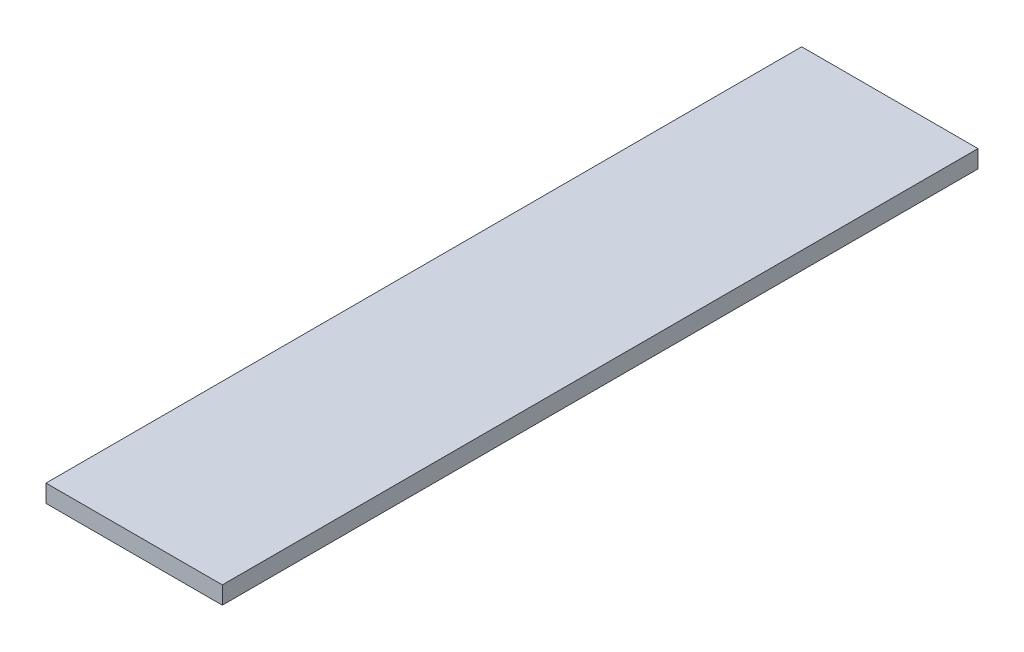
ISO-10303-21;
HEADER;
FILE_DESCRIPTION(('STEP AP214'),'2;1');
FILE_NAME('part.step','',(''),(''),'','','');
FILE_SCHEMA(('AUTOMOTIVE_DESIGN { 1 0 10303 214 1 1 1 1 }'));
ENDSEC;
DATA;
#1=APPLICATION_CONTEXT('core data for automotive mechanical design processes');
#2=APPLICATION_PROTOCOL_DEFINITION('international standard','automotive_design',2000,#1);
#3=PRODUCT_CONTEXT('',#1,'mechanical');
#4=PRODUCT('Part','Part','',(#3));
#5=PRODUCT_RELATED_PRODUCT_CATEGORY('part','',(#4));
#6=PRODUCT_DEFINITION_FORMATION('','',#4);
#7=PRODUCT_DEFINITION_CONTEXT('part definition',#1,'design');
#8=PRODUCT_DEFINITION('design','',#6,#7);
#9=PRODUCT_DEFINITION_SHAPE('','',#8);
#10=(LENGTH_UNIT() NAMED_UNIT(*) SI_UNIT(.MILLI.,.METRE.));
#11=(NAMED_UNIT(*) PLANE_ANGLE_UNIT() SI_UNIT($,.RADIAN.));
#12=(NAMED_UNIT(*) SI_UNIT($,.STERADIAN.) SOLID_ANGLE_UNIT());
#13=UNCERTAINTY_MEASURE_WITH_UNIT(LENGTH_MEASURE(1.E-05),#10,'distance_accuracy_value','');
#14=(GEOMETRIC_REPRESENTATION_CONTEXT(3) GLOBAL_UNCERTAINTY_ASSIGNED_CONTEXT((#13)) GLOBAL_UNIT_ASSIGNED_CONTEXT((#10,
#11,#12)) REPRESENTATION_CONTEXT('',''));
#15=CARTESIAN_POINT('',(0.,0.,0.));
#16=DIRECTION('',(0.,0.,1.));
#17=DIRECTION('',(1.,0.,0.));
#18=AXIS2_PLACEMENT_3D('',#15,#16,#17);
#19=CARTESIAN_POINT('',(0.,0.,-300.));
#20=DIRECTION('',(-1.,0.,0.));
#21=DIRECTION('',(0.,0.,1.));
#22=AXIS2_PLACEMENT_3D('',#19,#20,#21);
#23=PLANE('',#22);
#24=DIRECTION('',(0.,-1.,0.));
#25=VECTOR('',#24,1.);
#26=CARTESIAN_POINT('',(0.,0.,0.));
#27=LINE('',#26,#25);
#28=CARTESIAN_POINT('',(0.,7.,0.));
#29=VERTEX_POINT('',#28);
#30=CARTESIAN_POINT('',(0.,0.,0.));
#31=VERTEX_POINT('',#30);
#32=EDGE_CURVE('E109',#29,#31,#27,.T.);
#33=ORIENTED_EDGE('',*,*,#32,.F.);
#34=DIRECTION('',(0.,0.,1.));
#35=VECTOR('',#34,1.);
#36=CARTESIAN_POINT('',(0.,7.,-300.));
#37=LINE('',#36,#35);
#38=CARTESIAN_POINT('',(0.,7.,-300.));
#39=VERTEX_POINT('',#38);
#40=EDGE_CURVE('E11',#39,#29,#37,.T.);
#41=ORIENTED_EDGE('',*,*,#40,.F.);
#42=DIRECTION('',(0.,-1.,0.));
#43=VECTOR('',#42,1.);
#44=CARTESIAN_POINT('',(0.,0.,-300.));
#45=LINE('',#44,#43);
#46=CARTESIAN_POINT('',(0.,0.,-300.));
#47=VERTEX_POINT('',#46);
#48=EDGE_CURVE('E101',#39,#47,#45,.T.);
#49=ORIENTED_EDGE('',*,*,#48,.T.);
#50=DIRECTION('',(0.,0.,1.));
#51=VECTOR('',#50,1.);
#52=CARTESIAN_POINT('',(0.,0.,-300.));
#53=LINE('',#52,#51);
#54=EDGE_CURVE('E42',#47,#31,#53,.T.);
#55=ORIENTED_EDGE('',*,*,#54,.T.);
#56=EDGE_LOOP('',(#33,#41,#49,#55));
#57=FACE_BOUND('',#56,.T.);
#58=ADVANCED_FACE('F39',(#57),#23,.T.);
#59=CARTESIAN_POINT('',(0.,7.,-300.));
#60=DIRECTION('',(0.,1.,0.));
#61=DIRECTION('',(0.,0.,1.));
#62=AXIS2_PLACEMENT_3D('',#59,#60,#61);
#63=PLANE('',#62);
#64=DIRECTION('',(-1.,0.,0.));
#65=VECTOR('',#64,1.);
#66=CARTESIAN_POINT('',(0.,7.,0.));
#67=LINE('',#66,#65);
#68=CARTESIAN_POINT('',(70.,7.,0.));
#69=VERTEX_POINT('',#68);
#70=EDGE_CURVE('E104',#69,#29,#67,.T.);
#71=ORIENTED_EDGE('',*,*,#70,.F.);
#72=DIRECTION('',(0.,0.,1.));
#73=VECTOR('',#72,1.);
#74=CARTESIAN_POINT('',(70.,7.,-300.));
#75=LINE('',#74,#73);
#76=CARTESIAN_POINT('',(70.,7.,-300.));
#77=VERTEX_POINT('',#76);
#78=EDGE_CURVE('E49',#77,#69,#75,.T.);
#79=ORIENTED_EDGE('',*,*,#78,.F.);
#80=DIRECTION('',(-1.,0.,0.));
#81=VECTOR('',#80,1.);
#82=CARTESIAN_POINT('',(0.,7.,-300.));
#83=LINE('',#82,#81);
#84=EDGE_CURVE('E96',#77,#39,#83,.T.);
#85=ORIENTED_EDGE('',*,*,#84,.T.);
#86=ORIENTED_EDGE('',*,*,#40,.T.);
#87=EDGE_LOOP('',(#71,#79,#85,#86));
#88=FACE_BOUND('',#87,.T.);
#89=ADVANCED_FACE('F125',(#88),#63,.T.);
#90=CARTESIAN_POINT('',(70.,0.,-300.));
#91=DIRECTION('',(1.,0.,0.));
#92=DIRECTION('',(0.,0.,-1.));
#93=AXIS2_PLACEMENT_3D('',#90,#91,#92);
#94=PLANE('',#93);
#95=DIRECTION('',(0.,1.,0.));
#96=VECTOR('',#95,1.);
#97=CARTESIAN_POINT('',(70.,0.,0.));
#98=LINE('',#97,#96);
#99=CARTESIAN_POINT('',(70.,0.,0.));
#100=VERTEX_POINT('',#99);
#101=EDGE_CURVE('E90',#100,#69,#98,.T.);
#102=ORIENTED_EDGE('',*,*,#101,.F.);
#103=DIRECTION('',(0.,0.,1.));
#104=VECTOR('',#103,1.);
#105=CARTESIAN_POINT('',(70.,0.,-300.));
#106=LINE('',#105,#104);
#107=CARTESIAN_POINT('',(70.,0.,-300.));
#108=VERTEX_POINT('',#107);
#109=EDGE_CURVE('E85',#108,#100,#106,.T.);
#110=ORIENTED_EDGE('',*,*,#109,.F.);
#111=DIRECTION('',(0.,1.,0.));
#112=VECTOR('',#111,1.);
#113=CARTESIAN_POINT('',(70.,0.,-300.));
#114=LINE('',#113,#112);
#115=EDGE_CURVE('E88',#108,#77,#114,.T.);
#116=ORIENTED_EDGE('',*,*,#115,.T.);
#117=ORIENTED_EDGE('',*,*,#78,.T.);
#118=EDGE_LOOP('',(#102,#110,#116,#117));
#119=FACE_BOUND('',#118,.T.);
#120=ADVANCED_FACE('F87',(#119),#94,.T.);
#121=CARTESIAN_POINT('',(0.,0.,-300.));
#122=DIRECTION('',(0.,-1.,0.));
#123=DIRECTION('',(0.,0.,-1.));
#124=AXIS2_PLACEMENT_3D('',#121,#122,#123);
#125=PLANE('',#124);
#126=DIRECTION('',(1.,0.,0.));
#127=VECTOR('',#126,1.);
#128=CARTESIAN_POINT('',(0.,0.,0.));
#129=LINE('',#128,#127);
#130=EDGE_CURVE('E113',#31,#100,#129,.T.);
#131=ORIENTED_EDGE('',*,*,#130,.F.);
#132=ORIENTED_EDGE('',*,*,#54,.F.);
#133=DIRECTION('',(1.,0.,0.));
#134=VECTOR('',#133,1.);
#135=CARTESIAN_POINT('',(0.,0.,-300.));
#136=LINE('',#135,#134);
#137=EDGE_CURVE('E95',#47,#108,#136,.T.);
#138=ORIENTED_EDGE('',*,*,#137,.T.);
#139=ORIENTED_EDGE('',*,*,#109,.T.);
#140=EDGE_LOOP('',(#131,#132,#138,#139));
#141=FACE_BOUND('',#140,.T.);
#142=ADVANCED_FACE('F99',(#141),#125,.T.);
#143=CARTESIAN_POINT('',(0.,0.,-300.));
#144=DIRECTION('',(0.,0.,-1.));
#145=DIRECTION('',(-1.,0.,0.));
#146=AXIS2_PLACEMENT_3D('',#143,#144,#145);
#147=PLANE('',#146);
#148=ORIENTED_EDGE('',*,*,#48,.F.);
#149=ORIENTED_EDGE('',*,*,#84,.F.);
#150=ORIENTED_EDGE('',*,*,#115,.F.);
#151=ORIENTED_EDGE('',*,*,#137,.F.);
#152=EDGE_LOOP('',(#148,#149,#150,#151));
#153=FACE_BOUND('',#152,.T.);
#154=ADVANCED_FACE('F94',(#153),#147,.T.);
#155=CARTESIAN_POINT('',(0.,0.,0.));
#156=DIRECTION('',(0.,0.,-1.));
#157=DIRECTION('',(-1.,0.,0.));
#158=AXIS2_PLACEMENT_3D('',#155,#156,#157);
#159=PLANE('',#158);
#160=ORIENTED_EDGE('',*,*,#32,.T.);
#161=ORIENTED_EDGE('',*,*,#130,.T.);
#162=ORIENTED_EDGE('',*,*,#101,.T.);
#163=ORIENTED_EDGE('',*,*,#70,.T.);
#164=EDGE_LOOP('',(#160,#161,#162,#163));
#165=FACE_BOUND('',#164,.T.);
#166=ADVANCED_FACE('F124',(#165),#159,.F.);
#167=CLOSED_SHELL('',(#58,#89,#120,#142,#154,#166));
#168=MANIFOLD_SOLID_BREP('B2',#167);
#169=ADVANCED_BREP_SHAPE_REPRESENTATION('',(#18,#168),#14);
#170=SHAPE_DEFINITION_REPRESENTATION(#9,#169);
ENDSEC;
END-ISO-10303-21;
